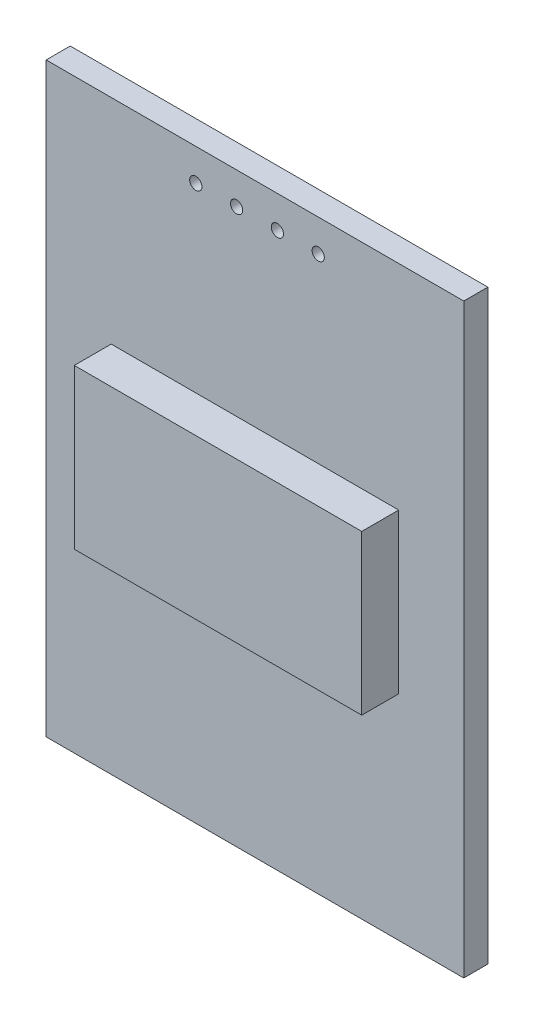
ISO-10303-21;
HEADER;
FILE_DESCRIPTION(('STEP AP214'),'2;1');
FILE_NAME('part.step','',(''),(''),'','','');
FILE_SCHEMA(('AUTOMOTIVE_DESIGN { 1 0 10303 214 1 1 1 1 }'));
ENDSEC;
DATA;
#1=APPLICATION_CONTEXT('core data for automotive mechanical design processes');
#2=APPLICATION_PROTOCOL_DEFINITION('international standard','automotive_design',2000,#1);
#3=PRODUCT_CONTEXT('',#1,'mechanical');
#4=PRODUCT('Part','Part','',(#3));
#5=PRODUCT_RELATED_PRODUCT_CATEGORY('part','',(#4));
#6=PRODUCT_DEFINITION_FORMATION('','',#4);
#7=PRODUCT_DEFINITION_CONTEXT('part definition',#1,'design');
#8=PRODUCT_DEFINITION('design','',#6,#7);
#9=PRODUCT_DEFINITION_SHAPE('','',#8);
#10=(LENGTH_UNIT() NAMED_UNIT(*) SI_UNIT(.MILLI.,.METRE.));
#11=(NAMED_UNIT(*) PLANE_ANGLE_UNIT() SI_UNIT($,.RADIAN.));
#12=(NAMED_UNIT(*) SI_UNIT($,.STERADIAN.) SOLID_ANGLE_UNIT());
#13=UNCERTAINTY_MEASURE_WITH_UNIT(LENGTH_MEASURE(1.E-05),#10,'distance_accuracy_value','');
#14=(GEOMETRIC_REPRESENTATION_CONTEXT(3) GLOBAL_UNCERTAINTY_ASSIGNED_CONTEXT((#13)) GLOBAL_UNIT_ASSIGNED_CONTEXT((#10,
#11,#12)) REPRESENTATION_CONTEXT('',''));
#15=CARTESIAN_POINT('',(0.,0.,0.));
#16=DIRECTION('',(0.,0.,1.));
#17=DIRECTION('',(1.,0.,0.));
#18=AXIS2_PLACEMENT_3D('',#15,#16,#17);
#19=CARTESIAN_POINT('',(-13.,-18.25,1.5));
#20=DIRECTION('',(1.,0.,0.));
#21=DIRECTION('',(0.,0.,-1.));
#22=AXIS2_PLACEMENT_3D('',#19,#20,#21);
#23=PLANE('',#22);
#24=DIRECTION('',(0.,-1.,0.));
#25=VECTOR('',#24,1.);
#26=CARTESIAN_POINT('',(-13.,-18.25,0.));
#27=LINE('',#26,#25);
#28=CARTESIAN_POINT('',(-13.,18.25,0.));
#29=VERTEX_POINT('',#28);
#30=CARTESIAN_POINT('',(-13.,-18.25,0.));
#31=VERTEX_POINT('',#30);
#32=EDGE_CURVE('E11',#29,#31,#27,.T.);
#33=ORIENTED_EDGE('',*,*,#32,.T.);
#34=DIRECTION('',(0.,0.,-1.));
#35=VECTOR('',#34,1.);
#36=CARTESIAN_POINT('',(-13.,-18.25,1.5));
#37=LINE('',#36,#35);
#38=CARTESIAN_POINT('',(-13.,-18.25,1.5));
#39=VERTEX_POINT('',#38);
#40=EDGE_CURVE('E47',#39,#31,#37,.T.);
#41=ORIENTED_EDGE('',*,*,#40,.F.);
#42=DIRECTION('',(0.,-1.,0.));
#43=VECTOR('',#42,1.);
#44=CARTESIAN_POINT('',(-13.,-18.25,1.5));
#45=LINE('',#44,#43);
#46=CARTESIAN_POINT('',(-13.,18.25,1.5));
#47=VERTEX_POINT('',#46);
#48=EDGE_CURVE('E196',#47,#39,#45,.T.);
#49=ORIENTED_EDGE('',*,*,#48,.F.);
#50=DIRECTION('',(0.,0.,-1.));
#51=VECTOR('',#50,1.);
#52=CARTESIAN_POINT('',(-13.,18.25,1.5));
#53=LINE('',#52,#51);
#54=EDGE_CURVE('E193',#47,#29,#53,.T.);
#55=ORIENTED_EDGE('',*,*,#54,.T.);
#56=EDGE_LOOP('',(#33,#41,#49,#55));
#57=FACE_BOUND('',#56,.T.);
#58=ADVANCED_FACE('F38',(#57),#23,.F.);
#59=CARTESIAN_POINT('',(13.,-18.25,1.5));
#60=DIRECTION('',(0.,1.,0.));
#61=DIRECTION('',(-1.,0.,0.));
#62=AXIS2_PLACEMENT_3D('',#59,#60,#61);
#63=PLANE('',#62);
#64=DIRECTION('',(1.,0.,0.));
#65=VECTOR('',#64,1.);
#66=CARTESIAN_POINT('',(13.,-18.25,0.));
#67=LINE('',#66,#65);
#68=CARTESIAN_POINT('',(13.,-18.25,0.));
#69=VERTEX_POINT('',#68);
#70=EDGE_CURVE('E190',#31,#69,#67,.T.);
#71=ORIENTED_EDGE('',*,*,#70,.T.);
#72=DIRECTION('',(0.,0.,-1.));
#73=VECTOR('',#72,1.);
#74=CARTESIAN_POINT('',(13.,-18.25,1.5));
#75=LINE('',#74,#73);
#76=CARTESIAN_POINT('',(13.,-18.25,1.5));
#77=VERTEX_POINT('',#76);
#78=EDGE_CURVE('E186',#77,#69,#75,.T.);
#79=ORIENTED_EDGE('',*,*,#78,.F.);
#80=DIRECTION('',(1.,0.,0.));
#81=VECTOR('',#80,1.);
#82=CARTESIAN_POINT('',(13.,-18.25,1.5));
#83=LINE('',#82,#81);
#84=EDGE_CURVE('E182',#39,#77,#83,.T.);
#85=ORIENTED_EDGE('',*,*,#84,.F.);
#86=ORIENTED_EDGE('',*,*,#40,.T.);
#87=EDGE_LOOP('',(#71,#79,#85,#86));
#88=FACE_BOUND('',#87,.T.);
#89=ADVANCED_FACE('F230',(#88),#63,.F.);
#90=CARTESIAN_POINT('',(13.,-18.25,1.5));
#91=DIRECTION('',(-1.,0.,0.));
#92=DIRECTION('',(0.,-1.,0.));
#93=AXIS2_PLACEMENT_3D('',#90,#91,#92);
#94=PLANE('',#93);
#95=DIRECTION('',(0.,1.,0.));
#96=VECTOR('',#95,1.);
#97=CARTESIAN_POINT('',(13.,-18.25,0.));
#98=LINE('',#97,#96);
#99=CARTESIAN_POINT('',(13.,18.25,0.));
#100=VERTEX_POINT('',#99);
#101=EDGE_CURVE('E179',#69,#100,#98,.T.);
#102=ORIENTED_EDGE('',*,*,#101,.T.);
#103=DIRECTION('',(0.,0.,-1.));
#104=VECTOR('',#103,1.);
#105=CARTESIAN_POINT('',(13.,18.25,1.5));
#106=LINE('',#105,#104);
#107=CARTESIAN_POINT('',(13.,18.25,1.5));
#108=VERTEX_POINT('',#107);
#109=EDGE_CURVE('E175',#108,#100,#106,.T.);
#110=ORIENTED_EDGE('',*,*,#109,.F.);
#111=DIRECTION('',(0.,1.,0.));
#112=VECTOR('',#111,1.);
#113=CARTESIAN_POINT('',(13.,-18.25,1.5));
#114=LINE('',#113,#112);
#115=EDGE_CURVE('E171',#77,#108,#114,.T.);
#116=ORIENTED_EDGE('',*,*,#115,.F.);
#117=ORIENTED_EDGE('',*,*,#78,.T.);
#118=EDGE_LOOP('',(#102,#110,#116,#117));
#119=FACE_BOUND('',#118,.T.);
#120=ADVANCED_FACE('F235',(#119),#94,.F.);
#121=CARTESIAN_POINT('',(13.,18.25,1.5));
#122=DIRECTION('',(0.,-1.,0.));
#123=DIRECTION('',(1.,0.,0.));
#124=AXIS2_PLACEMENT_3D('',#121,#122,#123);
#125=PLANE('',#124);
#126=DIRECTION('',(-1.,0.,0.));
#127=VECTOR('',#126,1.);
#128=CARTESIAN_POINT('',(13.,18.25,0.));
#129=LINE('',#128,#127);
#130=EDGE_CURVE('E167',#100,#29,#129,.T.);
#131=ORIENTED_EDGE('',*,*,#130,.T.);
#132=ORIENTED_EDGE('',*,*,#54,.F.);
#133=DIRECTION('',(-1.,0.,0.));
#134=VECTOR('',#133,1.);
#135=CARTESIAN_POINT('',(13.,18.25,1.5));
#136=LINE('',#135,#134);
#137=EDGE_CURVE('E163',#108,#47,#136,.T.);
#138=ORIENTED_EDGE('',*,*,#137,.F.);
#139=ORIENTED_EDGE('',*,*,#109,.T.);
#140=EDGE_LOOP('',(#131,#132,#138,#139));
#141=FACE_BOUND('',#140,.T.);
#142=ADVANCED_FACE('F241',(#141),#125,.F.);
#143=CARTESIAN_POINT('',(0.,0.,1.5));
#144=DIRECTION('',(0.,0.,1.));
#145=DIRECTION('',(1.,0.,0.));
#146=AXIS2_PLACEMENT_3D('',#143,#144,#145);
#147=PLANE('',#146);
#148=CARTESIAN_POINT('',(-3.68299918920678,16.2560011764702,1.5));
#149=DIRECTION('',(0.,0.,1.));
#150=DIRECTION('',(1.,0.,0.));
#151=AXIS2_PLACEMENT_3D('',#148,#149,#150);
#152=CIRCLE('',#151,0.381000000000004);
#153=CARTESIAN_POINT('',(-3.30199918920677,16.2560011764702,1.5));
#154=VERTEX_POINT('',#153);
#155=EDGE_CURVE('E205',#154,#154,#152,.T.);
#156=ORIENTED_EDGE('',*,*,#155,.F.);
#157=EDGE_LOOP('',(#156));
#158=FACE_BOUND('',#157,.T.);
#159=CARTESIAN_POINT('',(-1.14299918920686,16.2560009544162,1.5));
#160=DIRECTION('',(0.,0.,1.));
#161=DIRECTION('',(1.,0.,0.));
#162=AXIS2_PLACEMENT_3D('',#159,#160,#161);
#163=CIRCLE('',#162,0.381000000000001);
#164=CARTESIAN_POINT('',(-0.761999189206863,16.2560009544162,1.5));
#165=VERTEX_POINT('',#164);
#166=EDGE_CURVE('E282',#165,#165,#163,.T.);
#167=ORIENTED_EDGE('',*,*,#166,.F.);
#168=EDGE_LOOP('',(#167));
#169=FACE_BOUND('',#168,.T.);
#170=CARTESIAN_POINT('',(1.39700081079313,16.2560007323623,1.5));
#171=DIRECTION('',(0.,0.,1.));
#172=DIRECTION('',(1.,0.,0.));
#173=AXIS2_PLACEMENT_3D('',#170,#171,#172);
#174=CIRCLE('',#173,0.381000000000001);
#175=CARTESIAN_POINT('',(1.77800081079313,16.2560007323623,1.5));
#176=VERTEX_POINT('',#175);
#177=EDGE_CURVE('E280',#176,#176,#174,.T.);
#178=ORIENTED_EDGE('',*,*,#177,.F.);
#179=EDGE_LOOP('',(#178));
#180=FACE_BOUND('',#179,.T.);
#181=CARTESIAN_POINT('',(3.93700081079312,16.2560005103083,1.5));
#182=DIRECTION('',(0.,0.,1.));
#183=DIRECTION('',(1.,0.,0.));
#184=AXIS2_PLACEMENT_3D('',#181,#182,#183);
#185=CIRCLE('',#184,0.381000000000001);
#186=CARTESIAN_POINT('',(4.31800081079312,16.2560005103083,1.5));
#187=VERTEX_POINT('',#186);
#188=EDGE_CURVE('E135',#187,#187,#185,.T.);
#189=ORIENTED_EDGE('',*,*,#188,.F.);
#190=EDGE_LOOP('',(#189));
#191=FACE_BOUND('',#190,.T.);
#192=DIRECTION('',(0.,-1.,0.));
#193=VECTOR('',#192,1.);
#194=CARTESIAN_POINT('',(-8.9488134637361,-4.9547102793567,1.5));
#195=LINE('',#194,#193);
#196=CARTESIAN_POINT('',(-8.9488134637361,4.9547102793567,1.5));
#197=VERTEX_POINT('',#196);
#198=CARTESIAN_POINT('',(-8.9488134637361,-4.9547102793567,1.5));
#199=VERTEX_POINT('',#198);
#200=EDGE_CURVE('E160',#197,#199,#195,.T.);
#201=ORIENTED_EDGE('',*,*,#200,.F.);
#202=DIRECTION('',(-1.,0.,0.));
#203=VECTOR('',#202,1.);
#204=CARTESIAN_POINT('',(8.9488134637361,4.9547102793567,1.5));
#205=LINE('',#204,#203);
#206=CARTESIAN_POINT('',(8.9488134637361,4.9547102793567,1.5));
#207=VERTEX_POINT('',#206);
#208=EDGE_CURVE('E157',#207,#197,#205,.T.);
#209=ORIENTED_EDGE('',*,*,#208,.F.);
#210=DIRECTION('',(0.,1.,0.));
#211=VECTOR('',#210,1.);
#212=CARTESIAN_POINT('',(8.9488134637361,-4.9547102793567,1.5));
#213=LINE('',#212,#211);
#214=CARTESIAN_POINT('',(8.9488134637361,-4.9547102793567,1.5));
#215=VERTEX_POINT('',#214);
#216=EDGE_CURVE('E108',#215,#207,#213,.T.);
#217=ORIENTED_EDGE('',*,*,#216,.F.);
#218=DIRECTION('',(1.,0.,0.));
#219=VECTOR('',#218,1.);
#220=CARTESIAN_POINT('',(8.9488134637361,-4.9547102793567,1.5));
#221=LINE('',#220,#219);
#222=EDGE_CURVE('E152',#199,#215,#221,.T.);
#223=ORIENTED_EDGE('',*,*,#222,.F.);
#224=EDGE_LOOP('',(#201,#209,#217,#223));
#225=FACE_BOUND('',#224,.T.);
#226=ORIENTED_EDGE('',*,*,#48,.T.);
#227=ORIENTED_EDGE('',*,*,#84,.T.);
#228=ORIENTED_EDGE('',*,*,#115,.T.);
#229=ORIENTED_EDGE('',*,*,#137,.T.);
#230=EDGE_LOOP('',(#226,#227,#228,#229));
#231=FACE_BOUND('',#230,.T.);
#232=ADVANCED_FACE('F247',(#158,#169,#180,#191,#225,#231),#147,.T.);
#233=CARTESIAN_POINT('',(0.,0.,0.));
#234=DIRECTION('',(0.,0.,1.));
#235=DIRECTION('',(1.,0.,0.));
#236=AXIS2_PLACEMENT_3D('',#233,#234,#235);
#237=PLANE('',#236);
#238=CARTESIAN_POINT('',(-3.68299918920678,16.2560011764702,0.));
#239=DIRECTION('',(0.,0.,1.));
#240=DIRECTION('',(1.,0.,0.));
#241=AXIS2_PLACEMENT_3D('',#238,#239,#240);
#242=CIRCLE('',#241,0.381000000000004);
#243=CARTESIAN_POINT('',(-3.30199918920677,16.2560011764702,0.));
#244=VERTEX_POINT('',#243);
#245=EDGE_CURVE('E41',#244,#244,#242,.T.);
#246=ORIENTED_EDGE('',*,*,#245,.T.);
#247=EDGE_LOOP('',(#246));
#248=FACE_BOUND('',#247,.T.);
#249=CARTESIAN_POINT('',(-1.14299918920686,16.2560009544162,0.));
#250=DIRECTION('',(0.,0.,1.));
#251=DIRECTION('',(1.,0.,0.));
#252=AXIS2_PLACEMENT_3D('',#249,#250,#251);
#253=CIRCLE('',#252,0.381000000000001);
#254=CARTESIAN_POINT('',(-0.761999189206863,16.2560009544162,0.));
#255=VERTEX_POINT('',#254);
#256=EDGE_CURVE('E133',#255,#255,#253,.T.);
#257=ORIENTED_EDGE('',*,*,#256,.T.);
#258=EDGE_LOOP('',(#257));
#259=FACE_BOUND('',#258,.T.);
#260=CARTESIAN_POINT('',(1.39700081079313,16.2560007323623,0.));
#261=DIRECTION('',(0.,0.,1.));
#262=DIRECTION('',(1.,0.,0.));
#263=AXIS2_PLACEMENT_3D('',#260,#261,#262);
#264=CIRCLE('',#263,0.381000000000001);
#265=CARTESIAN_POINT('',(1.77800081079313,16.2560007323623,0.));
#266=VERTEX_POINT('',#265);
#267=EDGE_CURVE('E204',#266,#266,#264,.T.);
#268=ORIENTED_EDGE('',*,*,#267,.T.);
#269=EDGE_LOOP('',(#268));
#270=FACE_BOUND('',#269,.T.);
#271=CARTESIAN_POINT('',(3.93700081079312,16.2560005103083,0.));
#272=DIRECTION('',(0.,0.,1.));
#273=DIRECTION('',(1.,0.,0.));
#274=AXIS2_PLACEMENT_3D('',#271,#272,#273);
#275=CIRCLE('',#274,0.381000000000001);
#276=CARTESIAN_POINT('',(4.31800081079312,16.2560005103083,0.));
#277=VERTEX_POINT('',#276);
#278=EDGE_CURVE('E201',#277,#277,#275,.T.);
#279=ORIENTED_EDGE('',*,*,#278,.T.);
#280=EDGE_LOOP('',(#279));
#281=FACE_BOUND('',#280,.T.);
#282=ORIENTED_EDGE('',*,*,#32,.F.);
#283=ORIENTED_EDGE('',*,*,#130,.F.);
#284=ORIENTED_EDGE('',*,*,#101,.F.);
#285=ORIENTED_EDGE('',*,*,#70,.F.);
#286=EDGE_LOOP('',(#282,#283,#284,#285));
#287=FACE_BOUND('',#286,.T.);
#288=ADVANCED_FACE('F210',(#248,#259,#270,#281,#287),#237,.F.);
#289=CARTESIAN_POINT('',(-8.9488134637361,-4.9547102793567,3.8));
#290=DIRECTION('',(1.,0.,0.));
#291=DIRECTION('',(0.,0.,-1.));
#292=AXIS2_PLACEMENT_3D('',#289,#290,#291);
#293=PLANE('',#292);
#294=ORIENTED_EDGE('',*,*,#200,.T.);
#295=DIRECTION('',(0.,0.,-1.));
#296=VECTOR('',#295,1.);
#297=CARTESIAN_POINT('',(-8.9488134637361,-4.9547102793567,3.8));
#298=LINE('',#297,#296);
#299=CARTESIAN_POINT('',(-8.9488134637361,-4.9547102793567,3.8));
#300=VERTEX_POINT('',#299);
#301=EDGE_CURVE('E148',#300,#199,#298,.T.);
#302=ORIENTED_EDGE('',*,*,#301,.F.);
#303=DIRECTION('',(0.,-1.,0.));
#304=VECTOR('',#303,1.);
#305=CARTESIAN_POINT('',(-8.9488134637361,-4.9547102793567,3.8));
#306=LINE('',#305,#304);
#307=CARTESIAN_POINT('',(-8.9488134637361,4.9547102793567,3.8));
#308=VERTEX_POINT('',#307);
#309=EDGE_CURVE('E145',#308,#300,#306,.T.);
#310=ORIENTED_EDGE('',*,*,#309,.F.);
#311=DIRECTION('',(0.,0.,-1.));
#312=VECTOR('',#311,1.);
#313=CARTESIAN_POINT('',(-8.9488134637361,4.9547102793567,3.8));
#314=LINE('',#313,#312);
#315=EDGE_CURVE('E127',#308,#197,#314,.T.);
#316=ORIENTED_EDGE('',*,*,#315,.T.);
#317=EDGE_LOOP('',(#294,#302,#310,#316));
#318=FACE_BOUND('',#317,.T.);
#319=ADVANCED_FACE('F254',(#318),#293,.F.);
#320=CARTESIAN_POINT('',(8.9488134637361,-4.9547102793567,3.8));
#321=DIRECTION('',(0.,1.,0.));
#322=DIRECTION('',(0.,0.,1.));
#323=AXIS2_PLACEMENT_3D('',#320,#321,#322);
#324=PLANE('',#323);
#325=ORIENTED_EDGE('',*,*,#222,.T.);
#326=DIRECTION('',(0.,0.,-1.));
#327=VECTOR('',#326,1.);
#328=CARTESIAN_POINT('',(8.9488134637361,-4.9547102793567,3.8));
#329=LINE('',#328,#327);
#330=CARTESIAN_POINT('',(8.9488134637361,-4.9547102793567,3.8));
#331=VERTEX_POINT('',#330);
#332=EDGE_CURVE('E140',#331,#215,#329,.T.);
#333=ORIENTED_EDGE('',*,*,#332,.F.);
#334=DIRECTION('',(1.,0.,0.));
#335=VECTOR('',#334,1.);
#336=CARTESIAN_POINT('',(8.9488134637361,-4.9547102793567,3.8));
#337=LINE('',#336,#335);
#338=EDGE_CURVE('E113',#300,#331,#337,.T.);
#339=ORIENTED_EDGE('',*,*,#338,.F.);
#340=ORIENTED_EDGE('',*,*,#301,.T.);
#341=EDGE_LOOP('',(#325,#333,#339,#340));
#342=FACE_BOUND('',#341,.T.);
#343=ADVANCED_FACE('F258',(#342),#324,.F.);
#344=CARTESIAN_POINT('',(8.9488134637361,-4.9547102793567,3.8));
#345=DIRECTION('',(-1.,0.,0.));
#346=DIRECTION('',(0.,0.,1.));
#347=AXIS2_PLACEMENT_3D('',#344,#345,#346);
#348=PLANE('',#347);
#349=ORIENTED_EDGE('',*,*,#216,.T.);
#350=DIRECTION('',(0.,0.,-1.));
#351=VECTOR('',#350,1.);
#352=CARTESIAN_POINT('',(8.9488134637361,4.9547102793567,3.8));
#353=LINE('',#352,#351);
#354=CARTESIAN_POINT('',(8.9488134637361,4.9547102793567,3.8));
#355=VERTEX_POINT('',#354);
#356=EDGE_CURVE('E103',#355,#207,#353,.T.);
#357=ORIENTED_EDGE('',*,*,#356,.F.);
#358=DIRECTION('',(0.,1.,0.));
#359=VECTOR('',#358,1.);
#360=CARTESIAN_POINT('',(8.9488134637361,-4.9547102793567,3.8));
#361=LINE('',#360,#359);
#362=EDGE_CURVE('E107',#331,#355,#361,.T.);
#363=ORIENTED_EDGE('',*,*,#362,.F.);
#364=ORIENTED_EDGE('',*,*,#332,.T.);
#365=EDGE_LOOP('',(#349,#357,#363,#364));
#366=FACE_BOUND('',#365,.T.);
#367=ADVANCED_FACE('F105',(#366),#348,.F.);
#368=CARTESIAN_POINT('',(8.9488134637361,4.9547102793567,3.8));
#369=DIRECTION('',(0.,-1.,0.));
#370=DIRECTION('',(0.,0.,-1.));
#371=AXIS2_PLACEMENT_3D('',#368,#369,#370);
#372=PLANE('',#371);
#373=ORIENTED_EDGE('',*,*,#208,.T.);
#374=ORIENTED_EDGE('',*,*,#315,.F.);
#375=DIRECTION('',(-1.,0.,0.));
#376=VECTOR('',#375,1.);
#377=CARTESIAN_POINT('',(8.9488134637361,4.9547102793567,3.8));
#378=LINE('',#377,#376);
#379=EDGE_CURVE('E120',#355,#308,#378,.T.);
#380=ORIENTED_EDGE('',*,*,#379,.F.);
#381=ORIENTED_EDGE('',*,*,#356,.T.);
#382=EDGE_LOOP('',(#373,#374,#380,#381));
#383=FACE_BOUND('',#382,.T.);
#384=ADVANCED_FACE('F125',(#383),#372,.F.);
#385=CARTESIAN_POINT('',(0.,0.,3.8));
#386=DIRECTION('',(0.,0.,1.));
#387=DIRECTION('',(1.,0.,0.));
#388=AXIS2_PLACEMENT_3D('',#385,#386,#387);
#389=PLANE('',#388);
#390=ORIENTED_EDGE('',*,*,#309,.T.);
#391=ORIENTED_EDGE('',*,*,#338,.T.);
#392=ORIENTED_EDGE('',*,*,#362,.T.);
#393=ORIENTED_EDGE('',*,*,#379,.T.);
#394=EDGE_LOOP('',(#390,#391,#392,#393));
#395=FACE_BOUND('',#394,.T.);
#396=ADVANCED_FACE('F119',(#395),#389,.T.);
#397=CARTESIAN_POINT('',(3.93700081079312,16.2560005103083,-8.5));
#398=DIRECTION('',(0.,0.,1.));
#399=DIRECTION('',(1.,0.,0.));
#400=AXIS2_PLACEMENT_3D('',#397,#398,#399);
#401=CYLINDRICAL_SURFACE('',#400,0.381000000000001);
#402=ORIENTED_EDGE('',*,*,#188,.T.);
#403=EDGE_LOOP('',(#402));
#404=FACE_BOUND('',#403,.T.);
#405=ORIENTED_EDGE('',*,*,#278,.F.);
#406=EDGE_LOOP('',(#405));
#407=FACE_BOUND('',#406,.T.);
#408=ADVANCED_FACE('F225',(#404,#407),#401,.F.);
#409=CARTESIAN_POINT('',(1.39700081079313,16.2560007323623,-8.5));
#410=DIRECTION('',(0.,0.,1.));
#411=DIRECTION('',(1.,0.,0.));
#412=AXIS2_PLACEMENT_3D('',#409,#410,#411);
#413=CYLINDRICAL_SURFACE('',#412,0.381000000000001);
#414=ORIENTED_EDGE('',*,*,#177,.T.);
#415=EDGE_LOOP('',(#414));
#416=FACE_BOUND('',#415,.T.);
#417=ORIENTED_EDGE('',*,*,#267,.F.);
#418=EDGE_LOOP('',(#417));
#419=FACE_BOUND('',#418,.T.);
#420=ADVANCED_FACE('F216',(#416,#419),#413,.F.);
#421=CARTESIAN_POINT('',(-1.14299918920686,16.2560009544162,-8.5));
#422=DIRECTION('',(0.,0.,1.));
#423=DIRECTION('',(1.,0.,0.));
#424=AXIS2_PLACEMENT_3D('',#421,#422,#423);
#425=CYLINDRICAL_SURFACE('',#424,0.381000000000001);
#426=ORIENTED_EDGE('',*,*,#166,.T.);
#427=EDGE_LOOP('',(#426));
#428=FACE_BOUND('',#427,.T.);
#429=ORIENTED_EDGE('',*,*,#256,.F.);
#430=EDGE_LOOP('',(#429));
#431=FACE_BOUND('',#430,.T.);
#432=ADVANCED_FACE('F213',(#428,#431),#425,.F.);
#433=CARTESIAN_POINT('',(-3.68299918920678,16.2560011764702,-8.5));
#434=DIRECTION('',(0.,0.,1.));
#435=DIRECTION('',(1.,0.,0.));
#436=AXIS2_PLACEMENT_3D('',#433,#434,#435);
#437=CYLINDRICAL_SURFACE('',#436,0.381000000000004);
#438=ORIENTED_EDGE('',*,*,#155,.T.);
#439=EDGE_LOOP('',(#438));
#440=FACE_BOUND('',#439,.T.);
#441=ORIENTED_EDGE('',*,*,#245,.F.);
#442=EDGE_LOOP('',(#441));
#443=FACE_BOUND('',#442,.T.);
#444=ADVANCED_FACE('F215',(#440,#443),#437,.F.);
#445=CLOSED_SHELL('',(#58,#89,#120,#142,#232,#288,#319,#343,#367,#384,#396,#408,#420,#432,#444));
#446=MANIFOLD_SOLID_BREP('B2',#445);
#447=ADVANCED_BREP_SHAPE_REPRESENTATION('',(#18,#446),#14);
#448=SHAPE_DEFINITION_REPRESENTATION(#9,#447);
ENDSEC;
END-ISO-10303-21;
